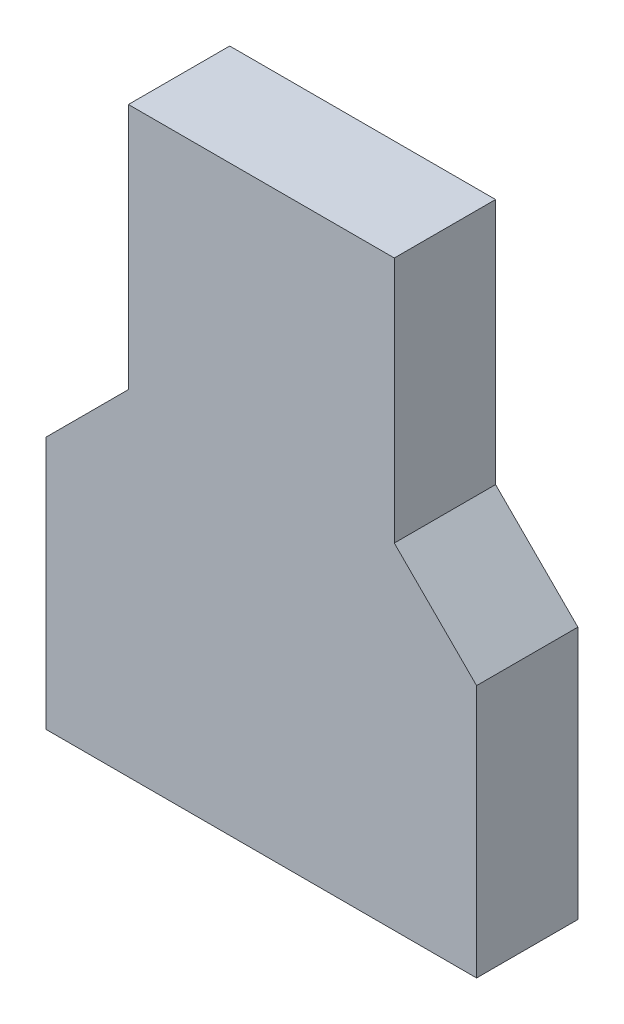
ISO-10303-21;
HEADER;
FILE_DESCRIPTION(('STEP AP214'),'2;1');
FILE_NAME('part.step','',(''),(''),'','','');
FILE_SCHEMA(('AUTOMOTIVE_DESIGN { 1 0 10303 214 1 1 1 1 }'));
ENDSEC;
DATA;
#1=APPLICATION_CONTEXT('core data for automotive mechanical design processes');
#2=APPLICATION_PROTOCOL_DEFINITION('international standard','automotive_design',2000,#1);
#3=PRODUCT_CONTEXT('',#1,'mechanical');
#4=PRODUCT('Part','Part','',(#3));
#5=PRODUCT_RELATED_PRODUCT_CATEGORY('part','',(#4));
#6=PRODUCT_DEFINITION_FORMATION('','',#4);
#7=PRODUCT_DEFINITION_CONTEXT('part definition',#1,'design');
#8=PRODUCT_DEFINITION('design','',#6,#7);
#9=PRODUCT_DEFINITION_SHAPE('','',#8);
#10=(LENGTH_UNIT() NAMED_UNIT(*) SI_UNIT(.MILLI.,.METRE.));
#11=(NAMED_UNIT(*) PLANE_ANGLE_UNIT() SI_UNIT($,.RADIAN.));
#12=(NAMED_UNIT(*) SI_UNIT($,.STERADIAN.) SOLID_ANGLE_UNIT());
#13=UNCERTAINTY_MEASURE_WITH_UNIT(LENGTH_MEASURE(1.E-05),#10,'distance_accuracy_value','');
#14=(GEOMETRIC_REPRESENTATION_CONTEXT(3) GLOBAL_UNCERTAINTY_ASSIGNED_CONTEXT((#13)) GLOBAL_UNIT_ASSIGNED_CONTEXT((#10,
#11,#12)) REPRESENTATION_CONTEXT('',''));
#15=CARTESIAN_POINT('',(0.,0.,0.));
#16=DIRECTION('',(0.,0.,1.));
#17=DIRECTION('',(1.,0.,0.));
#18=AXIS2_PLACEMENT_3D('',#15,#16,#17);
#19=CARTESIAN_POINT('',(2.625,0.874999999999994,1.));
#20=DIRECTION('',(-1.,0.,0.));
#21=DIRECTION('',(0.,0.,1.));
#22=AXIS2_PLACEMENT_3D('',#19,#20,#21);
#23=PLANE('',#22);
#24=DIRECTION('',(0.,1.,0.));
#25=VECTOR('',#24,1.);
#26=CARTESIAN_POINT('',(2.625,0.874999999999994,-1.));
#27=LINE('',#26,#25);
#28=CARTESIAN_POINT('',(2.625,0.874999999999994,-1.));
#29=VERTEX_POINT('',#28);
#30=CARTESIAN_POINT('',(2.625,5.75,-1.));
#31=VERTEX_POINT('',#30);
#32=EDGE_CURVE('E134',#29,#31,#27,.T.);
#33=ORIENTED_EDGE('',*,*,#32,.T.);
#34=DIRECTION('',(0.,0.,-1.));
#35=VECTOR('',#34,1.);
#36=CARTESIAN_POINT('',(2.625,5.75,1.));
#37=LINE('',#36,#35);
#38=CARTESIAN_POINT('',(2.625,5.75,1.));
#39=VERTEX_POINT('',#38);
#40=EDGE_CURVE('E11',#39,#31,#37,.T.);
#41=ORIENTED_EDGE('',*,*,#40,.F.);
#42=DIRECTION('',(0.,1.,0.));
#43=VECTOR('',#42,1.);
#44=CARTESIAN_POINT('',(2.625,0.874999999999994,1.));
#45=LINE('',#44,#43);
#46=CARTESIAN_POINT('',(2.625,0.874999999999994,1.));
#47=VERTEX_POINT('',#46);
#48=EDGE_CURVE('E149',#47,#39,#45,.T.);
#49=ORIENTED_EDGE('',*,*,#48,.F.);
#50=DIRECTION('',(0.,0.,-1.));
#51=VECTOR('',#50,1.);
#52=CARTESIAN_POINT('',(2.625,0.874999999999994,1.));
#53=LINE('',#52,#51);
#54=EDGE_CURVE('E130',#47,#29,#53,.T.);
#55=ORIENTED_EDGE('',*,*,#54,.T.);
#56=EDGE_LOOP('',(#33,#41,#49,#55));
#57=FACE_BOUND('',#56,.T.);
#58=ADVANCED_FACE('F39',(#57),#23,.F.);
#59=CARTESIAN_POINT('',(-2.625,5.75,1.));
#60=DIRECTION('',(0.,-1.,0.));
#61=DIRECTION('',(0.,0.,-1.));
#62=AXIS2_PLACEMENT_3D('',#59,#60,#61);
#63=PLANE('',#62);
#64=DIRECTION('',(-1.,0.,0.));
#65=VECTOR('',#64,1.);
#66=CARTESIAN_POINT('',(-2.625,5.75,-1.));
#67=LINE('',#66,#65);
#68=CARTESIAN_POINT('',(-2.625,5.75,-1.));
#69=VERTEX_POINT('',#68);
#70=EDGE_CURVE('E137',#31,#69,#67,.T.);
#71=ORIENTED_EDGE('',*,*,#70,.T.);
#72=DIRECTION('',(0.,0.,-1.));
#73=VECTOR('',#72,1.);
#74=CARTESIAN_POINT('',(-2.625,5.75,1.));
#75=LINE('',#74,#73);
#76=CARTESIAN_POINT('',(-2.625,5.75,1.));
#77=VERTEX_POINT('',#76);
#78=EDGE_CURVE('E47',#77,#69,#75,.T.);
#79=ORIENTED_EDGE('',*,*,#78,.F.);
#80=DIRECTION('',(-1.,0.,0.));
#81=VECTOR('',#80,1.);
#82=CARTESIAN_POINT('',(-2.625,5.75,1.));
#83=LINE('',#82,#81);
#84=EDGE_CURVE('E98',#39,#77,#83,.T.);
#85=ORIENTED_EDGE('',*,*,#84,.F.);
#86=ORIENTED_EDGE('',*,*,#40,.T.);
#87=EDGE_LOOP('',(#71,#79,#85,#86));
#88=FACE_BOUND('',#87,.T.);
#89=ADVANCED_FACE('F184',(#88),#63,.F.);
#90=CARTESIAN_POINT('',(-2.625,0.874999999999994,1.));
#91=DIRECTION('',(1.,0.,0.));
#92=DIRECTION('',(0.,0.,-1.));
#93=AXIS2_PLACEMENT_3D('',#90,#91,#92);
#94=PLANE('',#93);
#95=DIRECTION('',(0.,-1.,0.));
#96=VECTOR('',#95,1.);
#97=CARTESIAN_POINT('',(-2.625,0.874999999999994,-1.));
#98=LINE('',#97,#96);
#99=CARTESIAN_POINT('',(-2.625,0.874999999999994,-1.));
#100=VERTEX_POINT('',#99);
#101=EDGE_CURVE('E139',#69,#100,#98,.T.);
#102=ORIENTED_EDGE('',*,*,#101,.T.);
#103=DIRECTION('',(0.,0.,-1.));
#104=VECTOR('',#103,1.);
#105=CARTESIAN_POINT('',(-2.625,0.874999999999994,1.));
#106=LINE('',#105,#104);
#107=CARTESIAN_POINT('',(-2.625,0.874999999999994,1.));
#108=VERTEX_POINT('',#107);
#109=EDGE_CURVE('E156',#108,#100,#106,.T.);
#110=ORIENTED_EDGE('',*,*,#109,.F.);
#111=DIRECTION('',(0.,-1.,0.));
#112=VECTOR('',#111,1.);
#113=CARTESIAN_POINT('',(-2.625,0.874999999999994,1.));
#114=LINE('',#113,#112);
#115=EDGE_CURVE('E164',#77,#108,#114,.T.);
#116=ORIENTED_EDGE('',*,*,#115,.F.);
#117=ORIENTED_EDGE('',*,*,#78,.T.);
#118=EDGE_LOOP('',(#102,#110,#116,#117));
#119=FACE_BOUND('',#118,.T.);
#120=ADVANCED_FACE('F162',(#119),#94,.F.);
#121=CARTESIAN_POINT('',(-4.25,-0.750000000000001,1.));
#122=DIRECTION('',(0.707106781186546,-0.707106781186549,0.));
#123=DIRECTION('',(0.707106781186549,0.707106781186546,0.));
#124=AXIS2_PLACEMENT_3D('',#121,#122,#123);
#125=PLANE('',#124);
#126=DIRECTION('',(-0.707106781186549,-0.707106781186546,0.));
#127=VECTOR('',#126,1.);
#128=CARTESIAN_POINT('',(-4.25,-0.750000000000001,-1.));
#129=LINE('',#128,#127);
#130=CARTESIAN_POINT('',(-4.25,-0.750000000000001,-1.));
#131=VERTEX_POINT('',#130);
#132=EDGE_CURVE('E141',#100,#131,#129,.T.);
#133=ORIENTED_EDGE('',*,*,#132,.T.);
#134=DIRECTION('',(0.,0.,-1.));
#135=VECTOR('',#134,1.);
#136=CARTESIAN_POINT('',(-4.25,-0.750000000000001,1.));
#137=LINE('',#136,#135);
#138=CARTESIAN_POINT('',(-4.25,-0.750000000000001,1.));
#139=VERTEX_POINT('',#138);
#140=EDGE_CURVE('E153',#139,#131,#137,.T.);
#141=ORIENTED_EDGE('',*,*,#140,.F.);
#142=DIRECTION('',(-0.707106781186549,-0.707106781186546,0.));
#143=VECTOR('',#142,1.);
#144=CARTESIAN_POINT('',(-4.25,-0.750000000000001,1.));
#145=LINE('',#144,#143);
#146=EDGE_CURVE('E176',#108,#139,#145,.T.);
#147=ORIENTED_EDGE('',*,*,#146,.F.);
#148=ORIENTED_EDGE('',*,*,#109,.T.);
#149=EDGE_LOOP('',(#133,#141,#147,#148));
#150=FACE_BOUND('',#149,.T.);
#151=ADVANCED_FACE('F172',(#150),#125,.F.);
#152=CARTESIAN_POINT('',(-4.25,-5.75,1.));
#153=DIRECTION('',(1.,0.,0.));
#154=DIRECTION('',(0.,0.,-1.));
#155=AXIS2_PLACEMENT_3D('',#152,#153,#154);
#156=PLANE('',#155);
#157=DIRECTION('',(0.,-1.,0.));
#158=VECTOR('',#157,1.);
#159=CARTESIAN_POINT('',(-4.25,-5.75,-1.));
#160=LINE('',#159,#158);
#161=CARTESIAN_POINT('',(-4.25,-5.75,-1.));
#162=VERTEX_POINT('',#161);
#163=EDGE_CURVE('E143',#131,#162,#160,.T.);
#164=ORIENTED_EDGE('',*,*,#163,.T.);
#165=DIRECTION('',(0.,0.,-1.));
#166=VECTOR('',#165,1.);
#167=CARTESIAN_POINT('',(-4.25,-5.75,1.));
#168=LINE('',#167,#166);
#169=CARTESIAN_POINT('',(-4.25,-5.75,1.));
#170=VERTEX_POINT('',#169);
#171=EDGE_CURVE('E125',#170,#162,#168,.T.);
#172=ORIENTED_EDGE('',*,*,#171,.F.);
#173=DIRECTION('',(0.,-1.,0.));
#174=VECTOR('',#173,1.);
#175=CARTESIAN_POINT('',(-4.25,-5.75,1.));
#176=LINE('',#175,#174);
#177=EDGE_CURVE('E117',#139,#170,#176,.T.);
#178=ORIENTED_EDGE('',*,*,#177,.F.);
#179=ORIENTED_EDGE('',*,*,#140,.T.);
#180=EDGE_LOOP('',(#164,#172,#178,#179));
#181=FACE_BOUND('',#180,.T.);
#182=ADVANCED_FACE('F175',(#181),#156,.F.);
#183=CARTESIAN_POINT('',(2.625,-5.75,1.));
#184=DIRECTION('',(0.,1.,0.));
#185=DIRECTION('',(0.,0.,1.));
#186=AXIS2_PLACEMENT_3D('',#183,#184,#185);
#187=PLANE('',#186);
#188=DIRECTION('',(1.,0.,0.));
#189=VECTOR('',#188,1.);
#190=CARTESIAN_POINT('',(2.625,-5.75,-1.));
#191=LINE('',#190,#189);
#192=CARTESIAN_POINT('',(4.25,-5.75,-1.));
#193=VERTEX_POINT('',#192);
#194=EDGE_CURVE('E124',#162,#193,#191,.T.);
#195=ORIENTED_EDGE('',*,*,#194,.T.);
#196=DIRECTION('',(0.,0.,-1.));
#197=VECTOR('',#196,1.);
#198=CARTESIAN_POINT('',(4.25,-5.75,1.));
#199=LINE('',#198,#197);
#200=CARTESIAN_POINT('',(4.25,-5.75,1.));
#201=VERTEX_POINT('',#200);
#202=EDGE_CURVE('E122',#201,#193,#199,.T.);
#203=ORIENTED_EDGE('',*,*,#202,.F.);
#204=DIRECTION('',(1.,0.,0.));
#205=VECTOR('',#204,1.);
#206=CARTESIAN_POINT('',(-2.625,-5.75,1.));
#207=LINE('',#206,#205);
#208=EDGE_CURVE('E111',#170,#201,#207,.T.);
#209=ORIENTED_EDGE('',*,*,#208,.F.);
#210=ORIENTED_EDGE('',*,*,#171,.T.);
#211=EDGE_LOOP('',(#195,#203,#209,#210));
#212=FACE_BOUND('',#211,.T.);
#213=ADVANCED_FACE('F123',(#212),#187,.F.);
#214=CARTESIAN_POINT('',(4.25,-5.75,1.));
#215=DIRECTION('',(-1.,0.,0.));
#216=DIRECTION('',(0.,0.,1.));
#217=AXIS2_PLACEMENT_3D('',#214,#215,#216);
#218=PLANE('',#217);
#219=DIRECTION('',(0.,1.,0.));
#220=VECTOR('',#219,1.);
#221=CARTESIAN_POINT('',(4.25,-5.75,-1.));
#222=LINE('',#221,#220);
#223=CARTESIAN_POINT('',(4.25,-0.750000000000001,-1.));
#224=VERTEX_POINT('',#223);
#225=EDGE_CURVE('E84',#193,#224,#222,.T.);
#226=ORIENTED_EDGE('',*,*,#225,.T.);
#227=DIRECTION('',(0.,0.,-1.));
#228=VECTOR('',#227,1.);
#229=CARTESIAN_POINT('',(4.25,-0.750000000000001,1.));
#230=LINE('',#229,#228);
#231=CARTESIAN_POINT('',(4.25,-0.750000000000001,1.));
#232=VERTEX_POINT('',#231);
#233=EDGE_CURVE('E126',#232,#224,#230,.T.);
#234=ORIENTED_EDGE('',*,*,#233,.F.);
#235=DIRECTION('',(0.,1.,0.));
#236=VECTOR('',#235,1.);
#237=CARTESIAN_POINT('',(4.25,-5.75,1.));
#238=LINE('',#237,#236);
#239=EDGE_CURVE('E115',#201,#232,#238,.T.);
#240=ORIENTED_EDGE('',*,*,#239,.F.);
#241=ORIENTED_EDGE('',*,*,#202,.T.);
#242=EDGE_LOOP('',(#226,#234,#240,#241));
#243=FACE_BOUND('',#242,.T.);
#244=ADVANCED_FACE('F128',(#243),#218,.F.);
#245=CARTESIAN_POINT('',(4.25,-0.750000000000001,1.));
#246=DIRECTION('',(-0.707106781186546,-0.707106781186549,0.));
#247=DIRECTION('',(0.707106781186549,-0.707106781186546,0.));
#248=AXIS2_PLACEMENT_3D('',#245,#246,#247);
#249=PLANE('',#248);
#250=DIRECTION('',(-0.707106781186549,0.707106781186546,0.));
#251=VECTOR('',#250,1.);
#252=CARTESIAN_POINT('',(4.25,-0.750000000000001,-1.));
#253=LINE('',#252,#251);
#254=EDGE_CURVE('E90',#224,#29,#253,.T.);
#255=ORIENTED_EDGE('',*,*,#254,.T.);
#256=ORIENTED_EDGE('',*,*,#54,.F.);
#257=DIRECTION('',(-0.707106781186549,0.707106781186546,0.));
#258=VECTOR('',#257,1.);
#259=CARTESIAN_POINT('',(4.25,-0.750000000000001,1.));
#260=LINE('',#259,#258);
#261=EDGE_CURVE('E55',#232,#47,#260,.T.);
#262=ORIENTED_EDGE('',*,*,#261,.F.);
#263=ORIENTED_EDGE('',*,*,#233,.T.);
#264=EDGE_LOOP('',(#255,#256,#262,#263));
#265=FACE_BOUND('',#264,.T.);
#266=ADVANCED_FACE('F200',(#265),#249,.F.);
#267=CARTESIAN_POINT('',(0.,0.,1.));
#268=DIRECTION('',(0.,0.,-1.));
#269=DIRECTION('',(-1.,0.,0.));
#270=AXIS2_PLACEMENT_3D('',#267,#268,#269);
#271=PLANE('',#270);
#272=ORIENTED_EDGE('',*,*,#48,.T.);
#273=ORIENTED_EDGE('',*,*,#84,.T.);
#274=ORIENTED_EDGE('',*,*,#115,.T.);
#275=ORIENTED_EDGE('',*,*,#146,.T.);
#276=ORIENTED_EDGE('',*,*,#177,.T.);
#277=ORIENTED_EDGE('',*,*,#208,.T.);
#278=ORIENTED_EDGE('',*,*,#239,.T.);
#279=ORIENTED_EDGE('',*,*,#261,.T.);
#280=EDGE_LOOP('',(#272,#273,#274,#275,#276,#277,#278,#279));
#281=FACE_BOUND('',#280,.T.);
#282=ADVANCED_FACE('F113',(#281),#271,.F.);
#283=CARTESIAN_POINT('',(0.,0.,-1.));
#284=DIRECTION('',(0.,0.,-1.));
#285=DIRECTION('',(-1.,0.,0.));
#286=AXIS2_PLACEMENT_3D('',#283,#284,#285);
#287=PLANE('',#286);
#288=ORIENTED_EDGE('',*,*,#32,.F.);
#289=ORIENTED_EDGE('',*,*,#254,.F.);
#290=ORIENTED_EDGE('',*,*,#225,.F.);
#291=ORIENTED_EDGE('',*,*,#194,.F.);
#292=ORIENTED_EDGE('',*,*,#163,.F.);
#293=ORIENTED_EDGE('',*,*,#132,.F.);
#294=ORIENTED_EDGE('',*,*,#101,.F.);
#295=ORIENTED_EDGE('',*,*,#70,.F.);
#296=EDGE_LOOP('',(#288,#289,#290,#291,#292,#293,#294,#295));
#297=FACE_BOUND('',#296,.T.);
#298=ADVANCED_FACE('F168',(#297),#287,.T.);
#299=CLOSED_SHELL('',(#58,#89,#120,#151,#182,#213,#244,#266,#282,#298));
#300=MANIFOLD_SOLID_BREP('B2',#299);
#301=ADVANCED_BREP_SHAPE_REPRESENTATION('',(#18,#300),#14);
#302=SHAPE_DEFINITION_REPRESENTATION(#9,#301);
ENDSEC;
END-ISO-10303-21;
